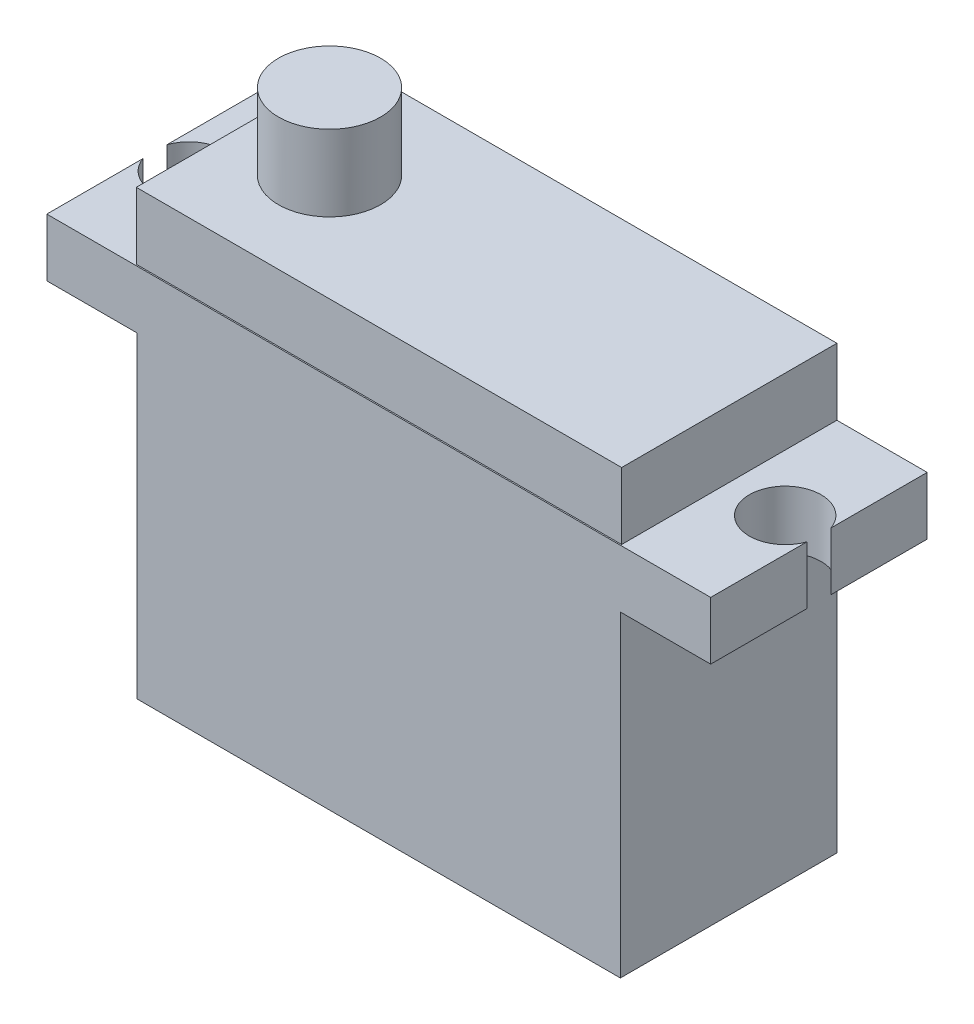
ISO-10303-21;
HEADER;
FILE_DESCRIPTION(('STEP AP214'),'2;1');
FILE_NAME('part.step','',(''),(''),'','','');
FILE_SCHEMA(('AUTOMOTIVE_DESIGN { 1 0 10303 214 1 1 1 1 }'));
ENDSEC;
DATA;
#1=APPLICATION_CONTEXT('core data for automotive mechanical design processes');
#2=APPLICATION_PROTOCOL_DEFINITION('international standard','automotive_design',2000,#1);
#3=PRODUCT_CONTEXT('',#1,'mechanical');
#4=PRODUCT('Part','Part','',(#3));
#5=PRODUCT_RELATED_PRODUCT_CATEGORY('part','',(#4));
#6=PRODUCT_DEFINITION_FORMATION('','',#4);
#7=PRODUCT_DEFINITION_CONTEXT('part definition',#1,'design');
#8=PRODUCT_DEFINITION('design','',#6,#7);
#9=PRODUCT_DEFINITION_SHAPE('','',#8);
#10=(LENGTH_UNIT() NAMED_UNIT(*) SI_UNIT(.MILLI.,.METRE.));
#11=(NAMED_UNIT(*) PLANE_ANGLE_UNIT() SI_UNIT($,.RADIAN.));
#12=(NAMED_UNIT(*) SI_UNIT($,.STERADIAN.) SOLID_ANGLE_UNIT());
#13=UNCERTAINTY_MEASURE_WITH_UNIT(LENGTH_MEASURE(1.E-05),#10,'distance_accuracy_value','');
#14=(GEOMETRIC_REPRESENTATION_CONTEXT(3) GLOBAL_UNCERTAINTY_ASSIGNED_CONTEXT((#13)) GLOBAL_UNIT_ASSIGNED_CONTEXT((#10,
#11,#12)) REPRESENTATION_CONTEXT('',''));
#15=CARTESIAN_POINT('',(0.,0.,0.));
#16=DIRECTION('',(0.,0.,1.));
#17=DIRECTION('',(1.,0.,0.));
#18=AXIS2_PLACEMENT_3D('',#15,#16,#17);
#19=CARTESIAN_POINT('',(19.9771,22.5552,6.5151));
#20=DIRECTION('',(-1.,0.,0.));
#21=DIRECTION('',(0.,0.,1.));
#22=AXIS2_PLACEMENT_3D('',#19,#20,#21);
#23=PLANE('',#22);
#24=DIRECTION('',(0.,0.,-1.));
#25=VECTOR('',#24,1.);
#26=CARTESIAN_POINT('',(19.9771,19.0754,6.5151));
#27=LINE('',#26,#25);
#28=CARTESIAN_POINT('',(19.9771,19.0754,6.5151));
#29=VERTEX_POINT('',#28);
#30=CARTESIAN_POINT('',(19.9771,19.0754,0.729559456110336));
#31=VERTEX_POINT('',#30);
#32=EDGE_CURVE('E186',#29,#31,#27,.T.);
#33=ORIENTED_EDGE('',*,*,#32,.T.);
#34=DIRECTION('',(0.,1.,0.));
#35=VECTOR('',#34,1.);
#36=CARTESIAN_POINT('',(19.9771,12.968825837673,0.729559456110336));
#37=LINE('',#36,#35);
#38=CARTESIAN_POINT('',(19.9771,22.5552,0.729559456110336));
#39=VERTEX_POINT('',#38);
#40=EDGE_CURVE('E11',#31,#39,#37,.T.);
#41=ORIENTED_EDGE('',*,*,#40,.T.);
#42=DIRECTION('',(0.,0.,-1.));
#43=VECTOR('',#42,1.);
#44=CARTESIAN_POINT('',(19.9771,22.5552,6.5151));
#45=LINE('',#44,#43);
#46=CARTESIAN_POINT('',(19.9771,22.5552,6.5151));
#47=VERTEX_POINT('',#46);
#48=EDGE_CURVE('E288',#47,#39,#45,.T.);
#49=ORIENTED_EDGE('',*,*,#48,.F.);
#50=DIRECTION('',(0.,-1.,0.));
#51=VECTOR('',#50,1.);
#52=CARTESIAN_POINT('',(19.9771,22.5552,6.5151));
#53=LINE('',#52,#51);
#54=EDGE_CURVE('E180',#47,#29,#53,.T.);
#55=ORIENTED_EDGE('',*,*,#54,.T.);
#56=EDGE_LOOP('',(#33,#41,#49,#55));
#57=FACE_BOUND('',#56,.T.);
#58=ADVANCED_FACE('F38',(#57),#23,.F.);
#59=CARTESIAN_POINT('',(-19.9771,22.5552,6.5151));
#60=DIRECTION('',(1.,0.,0.));
#61=DIRECTION('',(0.,0.,-1.));
#62=AXIS2_PLACEMENT_3D('',#59,#60,#61);
#63=PLANE('',#62);
#64=DIRECTION('',(0.,0.,1.));
#65=VECTOR('',#64,1.);
#66=CARTESIAN_POINT('',(-19.9771,19.0754,6.5151));
#67=LINE('',#66,#65);
#68=CARTESIAN_POINT('',(-19.9771,19.0754,-6.5151));
#69=VERTEX_POINT('',#68);
#70=CARTESIAN_POINT('',(-19.9771,19.0754,-0.729559456110336));
#71=VERTEX_POINT('',#70);
#72=EDGE_CURVE('E166',#69,#71,#67,.T.);
#73=ORIENTED_EDGE('',*,*,#72,.T.);
#74=DIRECTION('',(0.,1.,0.));
#75=VECTOR('',#74,1.);
#76=CARTESIAN_POINT('',(-19.9771,12.968825837673,-0.729559456110336));
#77=LINE('',#76,#75);
#78=CARTESIAN_POINT('',(-19.9771,22.5552,-0.729559456110336));
#79=VERTEX_POINT('',#78);
#80=EDGE_CURVE('E62',#71,#79,#77,.T.);
#81=ORIENTED_EDGE('',*,*,#80,.T.);
#82=DIRECTION('',(0.,0.,1.));
#83=VECTOR('',#82,1.);
#84=CARTESIAN_POINT('',(-19.9771,22.5552,6.5151));
#85=LINE('',#84,#83);
#86=CARTESIAN_POINT('',(-19.9771,22.5552,-6.5151));
#87=VERTEX_POINT('',#86);
#88=EDGE_CURVE('E164',#87,#79,#85,.T.);
#89=ORIENTED_EDGE('',*,*,#88,.F.);
#90=DIRECTION('',(0.,-1.,0.));
#91=VECTOR('',#90,1.);
#92=CARTESIAN_POINT('',(-19.9771,22.5552,-6.5151));
#93=LINE('',#92,#91);
#94=EDGE_CURVE('E212',#87,#69,#93,.T.);
#95=ORIENTED_EDGE('',*,*,#94,.T.);
#96=EDGE_LOOP('',(#73,#81,#89,#95));
#97=FACE_BOUND('',#96,.T.);
#98=ADVANCED_FACE('F162',(#97),#63,.F.);
#99=CARTESIAN_POINT('',(0.,22.5552,0.));
#100=DIRECTION('',(0.,-1.,0.));
#101=DIRECTION('',(0.,0.,-1.));
#102=AXIS2_PLACEMENT_3D('',#99,#100,#101);
#103=PLANE('',#102);
#104=ORIENTED_EDGE('',*,*,#88,.T.);
#105=CARTESIAN_POINT('',(-17.9451,22.5552,0.));
#106=DIRECTION('',(0.,1.,0.));
#107=DIRECTION('',(0.,0.,1.));
#108=AXIS2_PLACEMENT_3D('',#105,#106,#107);
#109=CIRCLE('',#108,2.159);
#110=CARTESIAN_POINT('',(-19.9771,22.5552,0.729559456110336));
#111=VERTEX_POINT('',#110);
#112=EDGE_CURVE('E150',#111,#79,#109,.T.);
#113=ORIENTED_EDGE('',*,*,#112,.F.);
#114=CARTESIAN_POINT('',(-19.9771,22.5552,6.5151));
#115=VERTEX_POINT('',#114);
#116=EDGE_CURVE('E176',#111,#115,#85,.T.);
#117=ORIENTED_EDGE('',*,*,#116,.T.);
#118=DIRECTION('',(1.,0.,0.));
#119=VECTOR('',#118,1.);
#120=CARTESIAN_POINT('',(-19.9771,22.5552,6.5151));
#121=LINE('',#120,#119);
#122=EDGE_CURVE('E175',#115,#47,#121,.T.);
#123=ORIENTED_EDGE('',*,*,#122,.T.);
#124=ORIENTED_EDGE('',*,*,#48,.T.);
#125=CARTESIAN_POINT('',(17.9451,22.5552,0.));
#126=DIRECTION('',(0.,1.,0.));
#127=DIRECTION('',(0.,0.,1.));
#128=AXIS2_PLACEMENT_3D('',#125,#126,#127);
#129=CIRCLE('',#128,2.159);
#130=CARTESIAN_POINT('',(19.9771,22.5552,-0.729559456110336));
#131=VERTEX_POINT('',#130);
#132=EDGE_CURVE('E294',#131,#39,#129,.T.);
#133=ORIENTED_EDGE('',*,*,#132,.F.);
#134=CARTESIAN_POINT('',(19.9771,22.5552,-6.5151));
#135=VERTEX_POINT('',#134);
#136=EDGE_CURVE('E204',#131,#135,#45,.T.);
#137=ORIENTED_EDGE('',*,*,#136,.T.);
#138=DIRECTION('',(-1.,0.,0.));
#139=VECTOR('',#138,1.);
#140=CARTESIAN_POINT('',(-19.9771,22.5552,-6.5151));
#141=LINE('',#140,#139);
#142=CARTESIAN_POINT('',(14.5415,22.5552,-6.5151));
#143=VERTEX_POINT('',#142);
#144=EDGE_CURVE('E182',#135,#143,#141,.T.);
#145=ORIENTED_EDGE('',*,*,#144,.T.);
#146=DIRECTION('',(0.,0.,-1.));
#147=VECTOR('',#146,1.);
#148=CARTESIAN_POINT('',(14.5415,22.5552,6.4389));
#149=LINE('',#148,#147);
#150=CARTESIAN_POINT('',(14.5415,22.5552,6.4389));
#151=VERTEX_POINT('',#150);
#152=EDGE_CURVE('E333',#151,#143,#149,.T.);
#153=ORIENTED_EDGE('',*,*,#152,.F.);
#154=DIRECTION('',(1.,0.,0.));
#155=VECTOR('',#154,1.);
#156=CARTESIAN_POINT('',(-14.6685,22.5552,6.4389));
#157=LINE('',#156,#155);
#158=CARTESIAN_POINT('',(-14.6685,22.5552,6.4389));
#159=VERTEX_POINT('',#158);
#160=EDGE_CURVE('E339',#159,#151,#157,.T.);
#161=ORIENTED_EDGE('',*,*,#160,.F.);
#162=DIRECTION('',(0.,0.,1.));
#163=VECTOR('',#162,1.);
#164=CARTESIAN_POINT('',(-14.6685,22.5552,6.4389));
#165=LINE('',#164,#163);
#166=CARTESIAN_POINT('',(-14.6685,22.5552,-6.5151));
#167=VERTEX_POINT('',#166);
#168=EDGE_CURVE('E351',#167,#159,#165,.T.);
#169=ORIENTED_EDGE('',*,*,#168,.F.);
#170=EDGE_CURVE('E172',#167,#87,#141,.T.);
#171=ORIENTED_EDGE('',*,*,#170,.T.);
#172=EDGE_LOOP('',(#104,#113,#117,#123,#124,#133,#137,#145,#153,#161,#169,#171));
#173=FACE_BOUND('',#172,.T.);
#174=ADVANCED_FACE('F170',(#173),#103,.F.);
#175=CARTESIAN_POINT('',(14.5415,19.0754,6.5151));
#176=DIRECTION('',(-1.,0.,0.));
#177=DIRECTION('',(0.,0.,1.));
#178=AXIS2_PLACEMENT_3D('',#175,#176,#177);
#179=PLANE('',#178);
#180=DIRECTION('',(0.,0.,-1.));
#181=VECTOR('',#180,1.);
#182=CARTESIAN_POINT('',(14.5415,0.,6.5151));
#183=LINE('',#182,#181);
#184=CARTESIAN_POINT('',(14.5415,0.,6.5151));
#185=VERTEX_POINT('',#184);
#186=CARTESIAN_POINT('',(14.5415,0.,-6.5151));
#187=VERTEX_POINT('',#186);
#188=EDGE_CURVE('E219',#185,#187,#183,.T.);
#189=ORIENTED_EDGE('',*,*,#188,.T.);
#190=DIRECTION('',(0.,-1.,0.));
#191=VECTOR('',#190,1.);
#192=CARTESIAN_POINT('',(14.5415,19.0754,-6.5151));
#193=LINE('',#192,#191);
#194=CARTESIAN_POINT('',(14.5415,19.0754,-6.5151));
#195=VERTEX_POINT('',#194);
#196=EDGE_CURVE('E252',#195,#187,#193,.T.);
#197=ORIENTED_EDGE('',*,*,#196,.F.);
#198=DIRECTION('',(0.,0.,-1.));
#199=VECTOR('',#198,1.);
#200=CARTESIAN_POINT('',(14.5415,19.0754,6.5151));
#201=LINE('',#200,#199);
#202=CARTESIAN_POINT('',(14.5415,19.0754,6.5151));
#203=VERTEX_POINT('',#202);
#204=EDGE_CURVE('E220',#203,#195,#201,.T.);
#205=ORIENTED_EDGE('',*,*,#204,.F.);
#206=DIRECTION('',(0.,-1.,0.));
#207=VECTOR('',#206,1.);
#208=CARTESIAN_POINT('',(14.5415,19.0754,6.5151));
#209=LINE('',#208,#207);
#210=EDGE_CURVE('E229',#203,#185,#209,.T.);
#211=ORIENTED_EDGE('',*,*,#210,.T.);
#212=EDGE_LOOP('',(#189,#197,#205,#211));
#213=FACE_BOUND('',#212,.T.);
#214=ADVANCED_FACE('F40',(#213),#179,.F.);
#215=CARTESIAN_POINT('',(-14.5415,19.0754,-6.5151));
#216=DIRECTION('',(0.,0.,1.));
#217=DIRECTION('',(1.,0.,0.));
#218=AXIS2_PLACEMENT_3D('',#215,#216,#217);
#219=PLANE('',#218);
#220=DIRECTION('',(-1.,0.,0.));
#221=VECTOR('',#220,1.);
#222=CARTESIAN_POINT('',(-14.5415,0.,-6.5151));
#223=LINE('',#222,#221);
#224=CARTESIAN_POINT('',(-14.5415,0.,-6.5151));
#225=VERTEX_POINT('',#224);
#226=EDGE_CURVE('E233',#187,#225,#223,.T.);
#227=ORIENTED_EDGE('',*,*,#226,.T.);
#228=DIRECTION('',(0.,-1.,0.));
#229=VECTOR('',#228,1.);
#230=CARTESIAN_POINT('',(-14.5415,19.0754,-6.5151));
#231=LINE('',#230,#229);
#232=CARTESIAN_POINT('',(-14.5415,19.0754,-6.5151));
#233=VERTEX_POINT('',#232);
#234=EDGE_CURVE('E248',#233,#225,#231,.T.);
#235=ORIENTED_EDGE('',*,*,#234,.F.);
#236=DIRECTION('',(-1.,0.,0.));
#237=VECTOR('',#236,1.);
#238=CARTESIAN_POINT('',(-19.9771,19.0754,-6.5151));
#239=LINE('',#238,#237);
#240=EDGE_CURVE('E190',#233,#69,#239,.T.);
#241=ORIENTED_EDGE('',*,*,#240,.T.);
#242=ORIENTED_EDGE('',*,*,#94,.F.);
#243=ORIENTED_EDGE('',*,*,#170,.F.);
#244=DIRECTION('',(0.,-1.,0.));
#245=VECTOR('',#244,1.);
#246=CARTESIAN_POINT('',(-14.6685,26.5684,-6.5151));
#247=LINE('',#246,#245);
#248=CARTESIAN_POINT('',(-14.6685,26.5684,-6.5151));
#249=VERTEX_POINT('',#248);
#250=EDGE_CURVE('E277',#249,#167,#247,.T.);
#251=ORIENTED_EDGE('',*,*,#250,.F.);
#252=DIRECTION('',(-1.,0.,0.));
#253=VECTOR('',#252,1.);
#254=CARTESIAN_POINT('',(-14.6685,26.5684,-6.5151));
#255=LINE('',#254,#253);
#256=CARTESIAN_POINT('',(14.5415,26.5684,-6.5151));
#257=VERTEX_POINT('',#256);
#258=EDGE_CURVE('E338',#257,#249,#255,.T.);
#259=ORIENTED_EDGE('',*,*,#258,.F.);
#260=DIRECTION('',(0.,-1.,0.));
#261=VECTOR('',#260,1.);
#262=CARTESIAN_POINT('',(14.5415,26.5684,-6.5151));
#263=LINE('',#262,#261);
#264=EDGE_CURVE('E274',#257,#143,#263,.T.);
#265=ORIENTED_EDGE('',*,*,#264,.T.);
#266=ORIENTED_EDGE('',*,*,#144,.F.);
#267=DIRECTION('',(0.,-1.,0.));
#268=VECTOR('',#267,1.);
#269=CARTESIAN_POINT('',(19.9771,22.5552,-6.5151));
#270=LINE('',#269,#268);
#271=CARTESIAN_POINT('',(19.9771,19.0754,-6.5151));
#272=VERTEX_POINT('',#271);
#273=EDGE_CURVE('E215',#135,#272,#270,.T.);
#274=ORIENTED_EDGE('',*,*,#273,.T.);
#275=EDGE_CURVE('E192',#272,#195,#239,.T.);
#276=ORIENTED_EDGE('',*,*,#275,.T.);
#277=ORIENTED_EDGE('',*,*,#196,.T.);
#278=EDGE_LOOP('',(#227,#235,#241,#242,#243,#251,#259,#265,#266,#274,#276,#277));
#279=FACE_BOUND('',#278,.T.);
#280=ADVANCED_FACE('F295',(#279),#219,.F.);
#281=CARTESIAN_POINT('',(-14.5415,19.0754,6.5151));
#282=DIRECTION('',(1.,0.,0.));
#283=DIRECTION('',(0.,0.,-1.));
#284=AXIS2_PLACEMENT_3D('',#281,#282,#283);
#285=PLANE('',#284);
#286=DIRECTION('',(0.,0.,1.));
#287=VECTOR('',#286,1.);
#288=CARTESIAN_POINT('',(-14.5415,0.,6.5151));
#289=LINE('',#288,#287);
#290=CARTESIAN_POINT('',(-14.5415,0.,6.5151));
#291=VERTEX_POINT('',#290);
#292=EDGE_CURVE('E236',#225,#291,#289,.T.);
#293=ORIENTED_EDGE('',*,*,#292,.T.);
#294=DIRECTION('',(0.,-1.,0.));
#295=VECTOR('',#294,1.);
#296=CARTESIAN_POINT('',(-14.5415,19.0754,6.5151));
#297=LINE('',#296,#295);
#298=CARTESIAN_POINT('',(-14.5415,19.0754,6.5151));
#299=VERTEX_POINT('',#298);
#300=EDGE_CURVE('E244',#299,#291,#297,.T.);
#301=ORIENTED_EDGE('',*,*,#300,.F.);
#302=DIRECTION('',(0.,0.,1.));
#303=VECTOR('',#302,1.);
#304=CARTESIAN_POINT('',(-14.5415,19.0754,6.5151));
#305=LINE('',#304,#303);
#306=EDGE_CURVE('E224',#233,#299,#305,.T.);
#307=ORIENTED_EDGE('',*,*,#306,.F.);
#308=ORIENTED_EDGE('',*,*,#234,.T.);
#309=EDGE_LOOP('',(#293,#301,#307,#308));
#310=FACE_BOUND('',#309,.T.);
#311=ADVANCED_FACE('F305',(#310),#285,.F.);
#312=CARTESIAN_POINT('',(-14.5415,19.0754,6.5151));
#313=DIRECTION('',(0.,0.,-1.));
#314=DIRECTION('',(-1.,0.,0.));
#315=AXIS2_PLACEMENT_3D('',#312,#313,#314);
#316=PLANE('',#315);
#317=DIRECTION('',(1.,0.,0.));
#318=VECTOR('',#317,1.);
#319=CARTESIAN_POINT('',(-14.5415,0.,6.5151));
#320=LINE('',#319,#318);
#321=EDGE_CURVE('E225',#291,#185,#320,.T.);
#322=ORIENTED_EDGE('',*,*,#321,.T.);
#323=ORIENTED_EDGE('',*,*,#210,.F.);
#324=DIRECTION('',(1.,0.,0.));
#325=VECTOR('',#324,1.);
#326=CARTESIAN_POINT('',(-19.9771,19.0754,6.5151));
#327=LINE('',#326,#325);
#328=EDGE_CURVE('E199',#203,#29,#327,.T.);
#329=ORIENTED_EDGE('',*,*,#328,.T.);
#330=ORIENTED_EDGE('',*,*,#54,.F.);
#331=ORIENTED_EDGE('',*,*,#122,.F.);
#332=DIRECTION('',(0.,-1.,0.));
#333=VECTOR('',#332,1.);
#334=CARTESIAN_POINT('',(-19.9771,22.5552,6.5151));
#335=LINE('',#334,#333);
#336=CARTESIAN_POINT('',(-19.9771,19.0754,6.5151));
#337=VERTEX_POINT('',#336);
#338=EDGE_CURVE('E208',#115,#337,#335,.T.);
#339=ORIENTED_EDGE('',*,*,#338,.T.);
#340=EDGE_CURVE('E200',#337,#299,#327,.T.);
#341=ORIENTED_EDGE('',*,*,#340,.T.);
#342=ORIENTED_EDGE('',*,*,#300,.T.);
#343=EDGE_LOOP('',(#322,#323,#329,#330,#331,#339,#341,#342));
#344=FACE_BOUND('',#343,.T.);
#345=ADVANCED_FACE('F308',(#344),#316,.F.);
#346=CARTESIAN_POINT('',(0.,0.,0.));
#347=DIRECTION('',(0.,-1.,0.));
#348=DIRECTION('',(0.,0.,-1.));
#349=AXIS2_PLACEMENT_3D('',#346,#347,#348);
#350=PLANE('',#349);
#351=ORIENTED_EDGE('',*,*,#188,.F.);
#352=ORIENTED_EDGE('',*,*,#321,.F.);
#353=ORIENTED_EDGE('',*,*,#292,.F.);
#354=ORIENTED_EDGE('',*,*,#226,.F.);
#355=EDGE_LOOP('',(#351,#352,#353,#354));
#356=FACE_BOUND('',#355,.T.);
#357=ADVANCED_FACE('F302',(#356),#350,.T.);
#358=CARTESIAN_POINT('',(0.,19.0754,0.));
#359=DIRECTION('',(0.,-1.,0.));
#360=DIRECTION('',(0.,0.,-1.));
#361=AXIS2_PLACEMENT_3D('',#358,#359,#360);
#362=PLANE('',#361);
#363=CARTESIAN_POINT('',(17.9451,19.0754,0.));
#364=DIRECTION('',(0.,-1.,0.));
#365=DIRECTION('',(0.,0.,-1.));
#366=AXIS2_PLACEMENT_3D('',#363,#364,#365);
#367=CIRCLE('',#366,2.159);
#368=CARTESIAN_POINT('',(19.9771,19.0754,-0.729559456110336));
#369=VERTEX_POINT('',#368);
#370=EDGE_CURVE('E54',#369,#31,#367,.F.);
#371=ORIENTED_EDGE('',*,*,#370,.T.);
#372=ORIENTED_EDGE('',*,*,#32,.F.);
#373=ORIENTED_EDGE('',*,*,#328,.F.);
#374=ORIENTED_EDGE('',*,*,#204,.T.);
#375=ORIENTED_EDGE('',*,*,#275,.F.);
#376=EDGE_CURVE('E191',#369,#272,#27,.T.);
#377=ORIENTED_EDGE('',*,*,#376,.F.);
#378=EDGE_LOOP('',(#371,#372,#373,#374,#375,#377));
#379=FACE_BOUND('',#378,.T.);
#380=ADVANCED_FACE('F271',(#379),#362,.T.);
#381=ORIENTED_EDGE('',*,*,#136,.F.);
#382=DIRECTION('',(0.,1.,0.));
#383=VECTOR('',#382,1.);
#384=CARTESIAN_POINT('',(19.9771,12.968825837673,-0.729559456110336));
#385=LINE('',#384,#383);
#386=EDGE_CURVE('E47',#131,#369,#385,.F.);
#387=ORIENTED_EDGE('',*,*,#386,.T.);
#388=ORIENTED_EDGE('',*,*,#376,.T.);
#389=ORIENTED_EDGE('',*,*,#273,.F.);
#390=EDGE_LOOP('',(#381,#387,#388,#389));
#391=FACE_BOUND('',#390,.T.);
#392=ADVANCED_FACE('F266',(#391),#23,.F.);
#393=ORIENTED_EDGE('',*,*,#116,.F.);
#394=DIRECTION('',(0.,1.,0.));
#395=VECTOR('',#394,1.);
#396=CARTESIAN_POINT('',(-19.9771,12.968825837673,0.729559456110336));
#397=LINE('',#396,#395);
#398=CARTESIAN_POINT('',(-19.9771,19.0754,0.729559456110336));
#399=VERTEX_POINT('',#398);
#400=EDGE_CURVE('E153',#111,#399,#397,.F.);
#401=ORIENTED_EDGE('',*,*,#400,.T.);
#402=EDGE_CURVE('E196',#399,#337,#67,.T.);
#403=ORIENTED_EDGE('',*,*,#402,.T.);
#404=ORIENTED_EDGE('',*,*,#338,.F.);
#405=EDGE_LOOP('',(#393,#401,#403,#404));
#406=FACE_BOUND('',#405,.T.);
#407=ADVANCED_FACE('F384',(#406),#63,.F.);
#408=CARTESIAN_POINT('',(-17.9451,19.0754,0.));
#409=DIRECTION('',(0.,-1.,0.));
#410=DIRECTION('',(0.,0.,-1.));
#411=AXIS2_PLACEMENT_3D('',#408,#409,#410);
#412=CIRCLE('',#411,2.159);
#413=EDGE_CURVE('E260',#71,#399,#412,.T.);
#414=ORIENTED_EDGE('',*,*,#413,.F.);
#415=ORIENTED_EDGE('',*,*,#72,.F.);
#416=ORIENTED_EDGE('',*,*,#240,.F.);
#417=ORIENTED_EDGE('',*,*,#306,.T.);
#418=ORIENTED_EDGE('',*,*,#340,.F.);
#419=ORIENTED_EDGE('',*,*,#402,.F.);
#420=EDGE_LOOP('',(#414,#415,#416,#417,#418,#419));
#421=FACE_BOUND('',#420,.T.);
#422=ADVANCED_FACE('F314',(#421),#362,.T.);
#423=CARTESIAN_POINT('',(14.5415,26.5684,6.4389));
#424=DIRECTION('',(-1.,0.,0.));
#425=DIRECTION('',(0.,0.,1.));
#426=AXIS2_PLACEMENT_3D('',#423,#424,#425);
#427=PLANE('',#426);
#428=ORIENTED_EDGE('',*,*,#152,.T.);
#429=ORIENTED_EDGE('',*,*,#264,.F.);
#430=DIRECTION('',(0.,0.,-1.));
#431=VECTOR('',#430,1.);
#432=CARTESIAN_POINT('',(14.5415,26.5684,6.4389));
#433=LINE('',#432,#431);
#434=CARTESIAN_POINT('',(14.5415,26.5684,6.4389));
#435=VERTEX_POINT('',#434);
#436=EDGE_CURVE('E334',#435,#257,#433,.T.);
#437=ORIENTED_EDGE('',*,*,#436,.F.);
#438=DIRECTION('',(0.,-1.,0.));
#439=VECTOR('',#438,1.);
#440=CARTESIAN_POINT('',(14.5415,26.5684,6.4389));
#441=LINE('',#440,#439);
#442=EDGE_CURVE('E348',#435,#151,#441,.T.);
#443=ORIENTED_EDGE('',*,*,#442,.T.);
#444=EDGE_LOOP('',(#428,#429,#437,#443));
#445=FACE_BOUND('',#444,.T.);
#446=ADVANCED_FACE('F375',(#445),#427,.F.);
#447=CARTESIAN_POINT('',(-14.6685,26.5684,6.4389));
#448=DIRECTION('',(1.,0.,0.));
#449=DIRECTION('',(0.,0.,-1.));
#450=AXIS2_PLACEMENT_3D('',#447,#448,#449);
#451=PLANE('',#450);
#452=ORIENTED_EDGE('',*,*,#168,.T.);
#453=DIRECTION('',(0.,-1.,0.));
#454=VECTOR('',#453,1.);
#455=CARTESIAN_POINT('',(-14.6685,26.5684,6.4389));
#456=LINE('',#455,#454);
#457=CARTESIAN_POINT('',(-14.6685,26.5684,6.4389));
#458=VERTEX_POINT('',#457);
#459=EDGE_CURVE('E285',#458,#159,#456,.T.);
#460=ORIENTED_EDGE('',*,*,#459,.F.);
#461=DIRECTION('',(0.,0.,1.));
#462=VECTOR('',#461,1.);
#463=CARTESIAN_POINT('',(-14.6685,26.5684,6.4389));
#464=LINE('',#463,#462);
#465=EDGE_CURVE('E342',#249,#458,#464,.T.);
#466=ORIENTED_EDGE('',*,*,#465,.F.);
#467=ORIENTED_EDGE('',*,*,#250,.T.);
#468=EDGE_LOOP('',(#452,#460,#466,#467));
#469=FACE_BOUND('',#468,.T.);
#470=ADVANCED_FACE('F369',(#469),#451,.F.);
#471=CARTESIAN_POINT('',(-14.6685,26.5684,6.4389));
#472=DIRECTION('',(0.,0.,-1.));
#473=DIRECTION('',(-1.,0.,0.));
#474=AXIS2_PLACEMENT_3D('',#471,#472,#473);
#475=PLANE('',#474);
#476=ORIENTED_EDGE('',*,*,#160,.T.);
#477=ORIENTED_EDGE('',*,*,#442,.F.);
#478=DIRECTION('',(1.,0.,0.));
#479=VECTOR('',#478,1.);
#480=CARTESIAN_POINT('',(-14.6685,26.5684,6.4389));
#481=LINE('',#480,#479);
#482=EDGE_CURVE('E345',#458,#435,#481,.T.);
#483=ORIENTED_EDGE('',*,*,#482,.F.);
#484=ORIENTED_EDGE('',*,*,#459,.T.);
#485=EDGE_LOOP('',(#476,#477,#483,#484));
#486=FACE_BOUND('',#485,.T.);
#487=ADVANCED_FACE('F365',(#486),#475,.F.);
#488=CARTESIAN_POINT('',(0.,26.5684,0.));
#489=DIRECTION('',(0.,-1.,0.));
#490=DIRECTION('',(0.,0.,-1.));
#491=AXIS2_PLACEMENT_3D('',#488,#489,#490);
#492=PLANE('',#491);
#493=CARTESIAN_POINT('',(-9.47709999999999,26.5684,0.));
#494=DIRECTION('',(0.,-1.,0.));
#495=DIRECTION('',(0.,0.,-1.));
#496=AXIS2_PLACEMENT_3D('',#493,#494,#495);
#497=CIRCLE('',#496,3.07107464478564);
#498=CARTESIAN_POINT('',(-9.47709999999999,26.5684,-3.07107464478564));
#499=VERTEX_POINT('',#498);
#500=EDGE_CURVE('E256',#499,#499,#497,.F.);
#501=ORIENTED_EDGE('',*,*,#500,.F.);
#502=EDGE_LOOP('',(#501));
#503=FACE_BOUND('',#502,.T.);
#504=ORIENTED_EDGE('',*,*,#436,.T.);
#505=ORIENTED_EDGE('',*,*,#258,.T.);
#506=ORIENTED_EDGE('',*,*,#465,.T.);
#507=ORIENTED_EDGE('',*,*,#482,.T.);
#508=EDGE_LOOP('',(#504,#505,#506,#507));
#509=FACE_BOUND('',#508,.T.);
#510=ADVANCED_FACE('F373',(#503,#509),#492,.F.);
#511=CARTESIAN_POINT('',(-9.47709999999999,31.1404,0.));
#512=DIRECTION('',(0.,-1.,0.));
#513=DIRECTION('',(0.,0.,-1.));
#514=AXIS2_PLACEMENT_3D('',#511,#512,#513);
#515=CYLINDRICAL_SURFACE('',#514,3.07107464478564);
#516=CARTESIAN_POINT('',(-9.47709999999999,31.1404,0.));
#517=DIRECTION('',(0.,1.,0.));
#518=DIRECTION('',(0.,0.,1.));
#519=AXIS2_PLACEMENT_3D('',#516,#517,#518);
#520=CIRCLE('',#519,3.07107464478564);
#521=CARTESIAN_POINT('',(-9.47709999999999,31.1404,3.07107464478564));
#522=VERTEX_POINT('',#521);
#523=EDGE_CURVE('E168',#522,#522,#520,.T.);
#524=ORIENTED_EDGE('',*,*,#523,.F.);
#525=EDGE_LOOP('',(#524));
#526=FACE_BOUND('',#525,.T.);
#527=ORIENTED_EDGE('',*,*,#500,.T.);
#528=EDGE_LOOP('',(#527));
#529=FACE_BOUND('',#528,.T.);
#530=ADVANCED_FACE('F468',(#526,#529),#515,.T.);
#531=CARTESIAN_POINT('',(-9.47709999999999,31.1404,0.));
#532=DIRECTION('',(0.,1.,0.));
#533=DIRECTION('',(0.,0.,1.));
#534=AXIS2_PLACEMENT_3D('',#531,#532,#533);
#535=PLANE('',#534);
#536=ORIENTED_EDGE('',*,*,#523,.T.);
#537=EDGE_LOOP('',(#536));
#538=FACE_BOUND('',#537,.T.);
#539=ADVANCED_FACE('F452',(#538),#535,.T.);
#540=CARTESIAN_POINT('',(-17.9451,12.968825837673,0.));
#541=DIRECTION('',(0.,1.,0.));
#542=DIRECTION('',(0.,0.,1.));
#543=AXIS2_PLACEMENT_3D('',#540,#541,#542);
#544=CYLINDRICAL_SURFACE('',#543,2.159);
#545=ORIENTED_EDGE('',*,*,#413,.T.);
#546=ORIENTED_EDGE('',*,*,#400,.F.);
#547=ORIENTED_EDGE('',*,*,#112,.T.);
#548=ORIENTED_EDGE('',*,*,#80,.F.);
#549=EDGE_LOOP('',(#545,#546,#547,#548));
#550=FACE_BOUND('',#549,.T.);
#551=ADVANCED_FACE('F151',(#550),#544,.F.);
#552=CARTESIAN_POINT('',(17.9451,12.968825837673,0.));
#553=DIRECTION('',(0.,1.,0.));
#554=DIRECTION('',(0.,0.,1.));
#555=AXIS2_PLACEMENT_3D('',#552,#553,#554);
#556=CYLINDRICAL_SURFACE('',#555,2.159);
#557=ORIENTED_EDGE('',*,*,#370,.F.);
#558=ORIENTED_EDGE('',*,*,#386,.F.);
#559=ORIENTED_EDGE('',*,*,#132,.T.);
#560=ORIENTED_EDGE('',*,*,#40,.F.);
#561=EDGE_LOOP('',(#557,#558,#559,#560));
#562=FACE_BOUND('',#561,.T.);
#563=ADVANCED_FACE('F322',(#562),#556,.F.);
#564=CLOSED_SHELL('',(#58,#98,#174,#214,#280,#311,#345,#357,#380,#392,#407,#422,#446,#470,#487,
#510,#530,#539,#551,#563));
#565=MANIFOLD_SOLID_BREP('B2',#564);
#566=ADVANCED_BREP_SHAPE_REPRESENTATION('',(#18,#565),#14);
#567=SHAPE_DEFINITION_REPRESENTATION(#9,#566);
ENDSEC;
END-ISO-10303-21;
